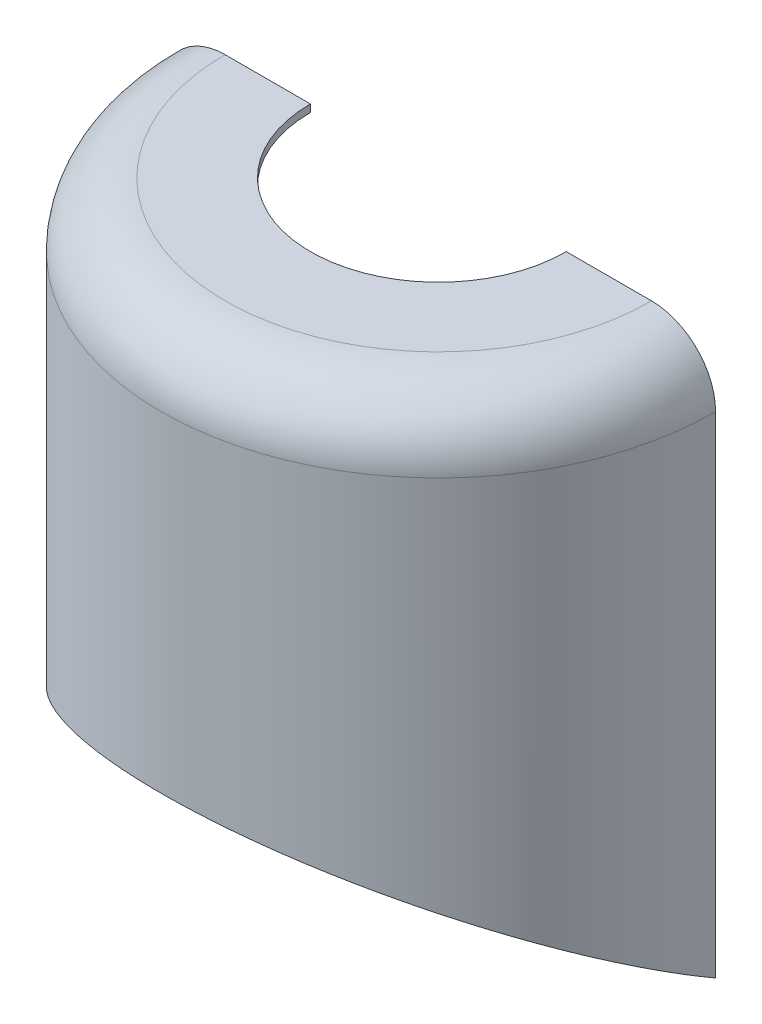
ISO-10303-21;
HEADER;
FILE_DESCRIPTION(('STEP AP214'),'2;1');
FILE_NAME('part.step','',(''),(''),'','','');
FILE_SCHEMA(('AUTOMOTIVE_DESIGN { 1 0 10303 214 1 1 1 1 }'));
ENDSEC;
DATA;
#1=APPLICATION_CONTEXT('core data for automotive mechanical design processes');
#2=APPLICATION_PROTOCOL_DEFINITION('international standard','automotive_design',2000,#1);
#3=PRODUCT_CONTEXT('',#1,'mechanical');
#4=PRODUCT('Part','Part','',(#3));
#5=PRODUCT_RELATED_PRODUCT_CATEGORY('part','',(#4));
#6=PRODUCT_DEFINITION_FORMATION('','',#4);
#7=PRODUCT_DEFINITION_CONTEXT('part definition',#1,'design');
#8=PRODUCT_DEFINITION('design','',#6,#7);
#9=PRODUCT_DEFINITION_SHAPE('','',#8);
#10=(LENGTH_UNIT() NAMED_UNIT(*) SI_UNIT(.MILLI.,.METRE.));
#11=(NAMED_UNIT(*) PLANE_ANGLE_UNIT() SI_UNIT($,.RADIAN.));
#12=(NAMED_UNIT(*) SI_UNIT($,.STERADIAN.) SOLID_ANGLE_UNIT());
#13=UNCERTAINTY_MEASURE_WITH_UNIT(LENGTH_MEASURE(1.E-05),#10,'distance_accuracy_value','');
#14=(GEOMETRIC_REPRESENTATION_CONTEXT(3) GLOBAL_UNCERTAINTY_ASSIGNED_CONTEXT((#13)) GLOBAL_UNIT_ASSIGNED_CONTEXT((#10,
#11,#12)) REPRESENTATION_CONTEXT('',''));
#15=CARTESIAN_POINT('',(0.,0.,0.));
#16=DIRECTION('',(0.,0.,1.));
#17=DIRECTION('',(1.,0.,0.));
#18=AXIS2_PLACEMENT_3D('',#15,#16,#17);
#19=CARTESIAN_POINT('',(26.,52.,-13.));
#20=DIRECTION('',(0.,0.,1.));
#21=DIRECTION('',(1.,0.,0.));
#22=AXIS2_PLACEMENT_3D('',#19,#20,#21);
#23=PLANE('',#22);
#24=DIRECTION('',(-1.,0.,0.));
#25=VECTOR('',#24,1.);
#26=CARTESIAN_POINT('',(26.,51.3,-13.));
#27=LINE('',#26,#25);
#28=CARTESIAN_POINT('',(20.,51.3,-13.));
#29=VERTEX_POINT('',#28);
#30=CARTESIAN_POINT('',(12.,51.3,-13.));
#31=VERTEX_POINT('',#30);
#32=EDGE_CURVE('E122',#29,#31,#27,.T.);
#33=ORIENTED_EDGE('',*,*,#32,.T.);
#34=DIRECTION('',(0.,1.,0.));
#35=VECTOR('',#34,1.);
#36=CARTESIAN_POINT('',(12.,20.,-13.));
#37=LINE('',#36,#35);
#38=CARTESIAN_POINT('',(12.,52.,-13.));
#39=VERTEX_POINT('',#38);
#40=EDGE_CURVE('E59',#31,#39,#37,.T.);
#41=ORIENTED_EDGE('',*,*,#40,.T.);
#42=DIRECTION('',(-1.,0.,0.));
#43=VECTOR('',#42,1.);
#44=CARTESIAN_POINT('',(26.,52.,-13.));
#45=LINE('',#44,#43);
#46=CARTESIAN_POINT('',(20.,52.,-13.));
#47=VERTEX_POINT('',#46);
#48=EDGE_CURVE('E119',#47,#39,#45,.T.);
#49=ORIENTED_EDGE('',*,*,#48,.F.);
#50=CARTESIAN_POINT('',(20.,46.,-13.));
#51=DIRECTION('',(0.,0.,1.));
#52=DIRECTION('',(1.,0.,0.));
#53=AXIS2_PLACEMENT_3D('',#50,#51,#52);
#54=CIRCLE('',#53,6.);
#55=CARTESIAN_POINT('',(26.,46.,-13.));
#56=VERTEX_POINT('',#55);
#57=EDGE_CURVE('E156',#47,#56,#54,.F.);
#58=ORIENTED_EDGE('',*,*,#57,.T.);
#59=DIRECTION('',(0.,-1.,0.));
#60=VECTOR('',#59,1.);
#61=CARTESIAN_POINT('',(26.,52.,-13.));
#62=LINE('',#61,#60);
#63=CARTESIAN_POINT('',(26.,0.,-13.));
#64=VERTEX_POINT('',#63);
#65=EDGE_CURVE('E137',#56,#64,#62,.T.);
#66=ORIENTED_EDGE('',*,*,#65,.T.);
#67=DIRECTION('',(-1.,0.,0.));
#68=VECTOR('',#67,1.);
#69=CARTESIAN_POINT('',(26.,0.,-13.));
#70=LINE('',#69,#68);
#71=CARTESIAN_POINT('',(-26.,0.,-13.));
#72=VERTEX_POINT('',#71);
#73=EDGE_CURVE('E139',#64,#72,#70,.T.);
#74=ORIENTED_EDGE('',*,*,#73,.T.);
#75=DIRECTION('',(0.,-1.,0.));
#76=VECTOR('',#75,1.);
#77=CARTESIAN_POINT('',(-26.,52.,-13.));
#78=LINE('',#77,#76);
#79=CARTESIAN_POINT('',(-26.,46.,-13.));
#80=VERTEX_POINT('',#79);
#81=EDGE_CURVE('E131',#80,#72,#78,.T.);
#82=ORIENTED_EDGE('',*,*,#81,.F.);
#83=CARTESIAN_POINT('',(-20.,46.,-13.));
#84=DIRECTION('',(0.,0.,1.));
#85=DIRECTION('',(1.,0.,0.));
#86=AXIS2_PLACEMENT_3D('',#83,#84,#85);
#87=CIRCLE('',#86,6.);
#88=CARTESIAN_POINT('',(-20.,52.,-13.));
#89=VERTEX_POINT('',#88);
#90=EDGE_CURVE('E152',#80,#89,#87,.F.);
#91=ORIENTED_EDGE('',*,*,#90,.T.);
#92=CARTESIAN_POINT('',(-12.,52.,-13.));
#93=VERTEX_POINT('',#92);
#94=EDGE_CURVE('E132',#93,#89,#45,.T.);
#95=ORIENTED_EDGE('',*,*,#94,.F.);
#96=DIRECTION('',(0.,1.,0.));
#97=VECTOR('',#96,1.);
#98=CARTESIAN_POINT('',(-12.,20.,-13.));
#99=LINE('',#98,#97);
#100=CARTESIAN_POINT('',(-12.,51.3,-13.));
#101=VERTEX_POINT('',#100);
#102=EDGE_CURVE('E110',#93,#101,#99,.F.);
#103=ORIENTED_EDGE('',*,*,#102,.T.);
#104=CARTESIAN_POINT('',(-20.,51.3,-13.));
#105=VERTEX_POINT('',#104);
#106=EDGE_CURVE('E276',#101,#105,#27,.T.);
#107=ORIENTED_EDGE('',*,*,#106,.T.);
#108=CARTESIAN_POINT('',(-20.,46.,-13.));
#109=DIRECTION('',(0.,0.,1.));
#110=DIRECTION('',(1.,0.,0.));
#111=AXIS2_PLACEMENT_3D('',#108,#109,#110);
#112=CIRCLE('',#111,5.3);
#113=CARTESIAN_POINT('',(-25.3,46.,-13.));
#114=VERTEX_POINT('',#113);
#115=EDGE_CURVE('E288',#114,#105,#112,.F.);
#116=ORIENTED_EDGE('',*,*,#115,.F.);
#117=DIRECTION('',(0.,-1.,0.));
#118=VECTOR('',#117,1.);
#119=CARTESIAN_POINT('',(-25.3,46.,-13.));
#120=LINE('',#119,#118);
#121=CARTESIAN_POINT('',(-25.3,0.808140901066355,-13.));
#122=VERTEX_POINT('',#121);
#123=EDGE_CURVE('E66',#114,#122,#120,.T.);
#124=ORIENTED_EDGE('',*,*,#123,.T.);
#125=DIRECTION('',(-1.,0.,0.));
#126=VECTOR('',#125,1.);
#127=CARTESIAN_POINT('',(26.,0.808140901066359,-13.));
#128=LINE('',#127,#126);
#129=CARTESIAN_POINT('',(25.3,0.80814090106635,-13.));
#130=VERTEX_POINT('',#129);
#131=EDGE_CURVE('E281',#130,#122,#128,.T.);
#132=ORIENTED_EDGE('',*,*,#131,.F.);
#133=DIRECTION('',(0.,-1.,0.));
#134=VECTOR('',#133,1.);
#135=CARTESIAN_POINT('',(25.3,46.,-13.));
#136=LINE('',#135,#134);
#137=CARTESIAN_POINT('',(25.3,46.,-13.));
#138=VERTEX_POINT('',#137);
#139=EDGE_CURVE('E294',#138,#130,#136,.T.);
#140=ORIENTED_EDGE('',*,*,#139,.F.);
#141=CARTESIAN_POINT('',(20.,46.,-13.));
#142=DIRECTION('',(0.,0.,1.));
#143=DIRECTION('',(1.,0.,0.));
#144=AXIS2_PLACEMENT_3D('',#141,#142,#143);
#145=CIRCLE('',#144,5.3);
#146=EDGE_CURVE('E290',#29,#138,#145,.F.);
#147=ORIENTED_EDGE('',*,*,#146,.F.);
#148=EDGE_LOOP('',(#33,#41,#49,#58,#66,#74,#82,#91,#95,#103,#107,#116,#124,#132,#140,#147));
#149=FACE_BOUND('',#148,.T.);
#150=ADVANCED_FACE('F43',(#149),#23,.F.);
#151=CARTESIAN_POINT('',(0.,52.,-13.));
#152=DIRECTION('',(0.,-1.,0.));
#153=DIRECTION('',(0.,0.,-1.));
#154=AXIS2_PLACEMENT_3D('',#151,#152,#153);
#155=CYLINDRICAL_SURFACE('',#154,26.);
#156=ORIENTED_EDGE('',*,*,#81,.T.);
#157=CARTESIAN_POINT('',(0.,0.,-13.));
#158=DIRECTION('',(0.,0.8661855860486,-0.499722453489577));
#159=DIRECTION('',(0.,-0.499722453489577,-0.866185586048601));
#160=AXIS2_PLACEMENT_3D('',#157,#158,#159);
#161=ELLIPSE('',#160,30.0166620396073,26.);
#162=EDGE_CURVE('E142',#72,#64,#161,.T.);
#163=ORIENTED_EDGE('',*,*,#162,.T.);
#164=ORIENTED_EDGE('',*,*,#65,.F.);
#165=CARTESIAN_POINT('',(0.,46.,-13.));
#166=DIRECTION('',(0.,1.,0.));
#167=DIRECTION('',(0.,0.,1.));
#168=AXIS2_PLACEMENT_3D('',#165,#166,#167);
#169=CIRCLE('',#168,26.);
#170=EDGE_CURVE('E52',#56,#80,#169,.F.);
#171=ORIENTED_EDGE('',*,*,#170,.T.);
#172=EDGE_LOOP('',(#156,#163,#164,#171));
#173=FACE_BOUND('',#172,.T.);
#174=ADVANCED_FACE('F163',(#173),#155,.T.);
#175=CARTESIAN_POINT('',(0.,52.,-13.));
#176=DIRECTION('',(0.,1.,0.));
#177=DIRECTION('',(0.,0.,1.));
#178=AXIS2_PLACEMENT_3D('',#175,#176,#177);
#179=PLANE('',#178);
#180=CARTESIAN_POINT('',(0.,52.,-13.));
#181=DIRECTION('',(0.,1.,0.));
#182=DIRECTION('',(0.,0.,1.));
#183=AXIS2_PLACEMENT_3D('',#180,#181,#182);
#184=CIRCLE('',#183,12.);
#185=EDGE_CURVE('E107',#93,#39,#184,.T.);
#186=ORIENTED_EDGE('',*,*,#185,.F.);
#187=ORIENTED_EDGE('',*,*,#94,.T.);
#188=CARTESIAN_POINT('',(0.,52.,-13.));
#189=DIRECTION('',(0.,1.,0.));
#190=DIRECTION('',(0.,0.,1.));
#191=AXIS2_PLACEMENT_3D('',#188,#189,#190);
#192=CIRCLE('',#191,20.);
#193=EDGE_CURVE('E129',#89,#47,#192,.T.);
#194=ORIENTED_EDGE('',*,*,#193,.T.);
#195=ORIENTED_EDGE('',*,*,#48,.T.);
#196=EDGE_LOOP('',(#186,#187,#194,#195));
#197=FACE_BOUND('',#196,.T.);
#198=ADVANCED_FACE('F127',(#197),#179,.T.);
#199=CARTESIAN_POINT('',(0.,46.,-13.));
#200=DIRECTION('',(0.,1.,0.));
#201=DIRECTION('',(0.,0.,1.));
#202=AXIS2_PLACEMENT_3D('',#199,#200,#201);
#203=TOROIDAL_SURFACE('',#202,20.,6.);
#204=ORIENTED_EDGE('',*,*,#90,.F.);
#205=ORIENTED_EDGE('',*,*,#170,.F.);
#206=ORIENTED_EDGE('',*,*,#57,.F.);
#207=ORIENTED_EDGE('',*,*,#193,.F.);
#208=EDGE_LOOP('',(#204,#205,#206,#207));
#209=FACE_BOUND('',#208,.T.);
#210=ADVANCED_FACE('F45',(#209),#203,.T.);
#211=CARTESIAN_POINT('',(-26.,0.,-13.));
#212=DIRECTION('',(0.,0.8661855860486,-0.499722453489577));
#213=DIRECTION('',(0.,0.499722453489577,0.8661855860486));
#214=AXIS2_PLACEMENT_3D('',#211,#212,#213);
#215=PLANE('',#214);
#216=ORIENTED_EDGE('',*,*,#73,.F.);
#217=ORIENTED_EDGE('',*,*,#162,.F.);
#218=EDGE_LOOP('',(#216,#217));
#219=FACE_BOUND('',#218,.T.);
#220=ADVANCED_FACE('F168',(#219),#215,.F.);
#221=CARTESIAN_POINT('',(0.,52.,-13.));
#222=DIRECTION('',(0.,-1.,0.));
#223=DIRECTION('',(0.,0.,-1.));
#224=AXIS2_PLACEMENT_3D('',#221,#222,#223);
#225=CYLINDRICAL_SURFACE('',#224,25.3);
#226=ORIENTED_EDGE('',*,*,#123,.F.);
#227=CARTESIAN_POINT('',(0.,46.,-13.));
#228=DIRECTION('',(0.,-1.,0.));
#229=DIRECTION('',(0.,0.,-1.));
#230=AXIS2_PLACEMENT_3D('',#227,#228,#229);
#231=CIRCLE('',#230,25.3);
#232=EDGE_CURVE('E293',#138,#114,#231,.T.);
#233=ORIENTED_EDGE('',*,*,#232,.F.);
#234=ORIENTED_EDGE('',*,*,#139,.T.);
#235=CARTESIAN_POINT('',(0.,0.808140901066359,-13.));
#236=DIRECTION('',(0.,0.8661855860486,-0.499722453489577));
#237=DIRECTION('',(0.,-0.499722453489577,-0.866185586048601));
#238=AXIS2_PLACEMENT_3D('',#235,#236,#237);
#239=ELLIPSE('',#238,29.2085211385409,25.3);
#240=EDGE_CURVE('E124',#122,#130,#239,.T.);
#241=ORIENTED_EDGE('',*,*,#240,.F.);
#242=EDGE_LOOP('',(#226,#233,#234,#241));
#243=FACE_BOUND('',#242,.T.);
#244=ADVANCED_FACE('F173',(#243),#225,.F.);
#245=CARTESIAN_POINT('',(0.,51.3,-13.));
#246=DIRECTION('',(0.,1.,0.));
#247=DIRECTION('',(0.,0.,1.));
#248=AXIS2_PLACEMENT_3D('',#245,#246,#247);
#249=PLANE('',#248);
#250=ORIENTED_EDGE('',*,*,#106,.F.);
#251=CARTESIAN_POINT('',(0.,51.3,-13.));
#252=DIRECTION('',(0.,1.,0.));
#253=DIRECTION('',(0.,0.,1.));
#254=AXIS2_PLACEMENT_3D('',#251,#252,#253);
#255=CIRCLE('',#254,12.);
#256=EDGE_CURVE('E11',#101,#31,#255,.T.);
#257=ORIENTED_EDGE('',*,*,#256,.T.);
#258=ORIENTED_EDGE('',*,*,#32,.F.);
#259=CARTESIAN_POINT('',(0.,51.3,-13.));
#260=DIRECTION('',(0.,1.,0.));
#261=DIRECTION('',(0.,0.,1.));
#262=AXIS2_PLACEMENT_3D('',#259,#260,#261);
#263=CIRCLE('',#262,20.);
#264=EDGE_CURVE('E277',#105,#29,#263,.T.);
#265=ORIENTED_EDGE('',*,*,#264,.F.);
#266=EDGE_LOOP('',(#250,#257,#258,#265));
#267=FACE_BOUND('',#266,.T.);
#268=ADVANCED_FACE('F190',(#267),#249,.F.);
#269=CARTESIAN_POINT('',(0.,46.,-13.));
#270=DIRECTION('',(0.,1.,0.));
#271=DIRECTION('',(0.,0.,1.));
#272=AXIS2_PLACEMENT_3D('',#269,#270,#271);
#273=TOROIDAL_SURFACE('',#272,20.,5.3);
#274=ORIENTED_EDGE('',*,*,#115,.T.);
#275=ORIENTED_EDGE('',*,*,#264,.T.);
#276=ORIENTED_EDGE('',*,*,#146,.T.);
#277=ORIENTED_EDGE('',*,*,#232,.T.);
#278=EDGE_LOOP('',(#274,#275,#276,#277));
#279=FACE_BOUND('',#278,.T.);
#280=ADVANCED_FACE('F186',(#279),#273,.F.);
#281=CARTESIAN_POINT('',(-26.,0.60632991023402,-13.3498057174427));
#282=DIRECTION('',(0.,0.8661855860486,-0.499722453489577));
#283=DIRECTION('',(0.,0.499722453489577,0.8661855860486));
#284=AXIS2_PLACEMENT_3D('',#281,#282,#283);
#285=PLANE('',#284);
#286=ORIENTED_EDGE('',*,*,#131,.T.);
#287=ORIENTED_EDGE('',*,*,#240,.T.);
#288=EDGE_LOOP('',(#286,#287));
#289=FACE_BOUND('',#288,.T.);
#290=ADVANCED_FACE('F183',(#289),#285,.T.);
#291=CARTESIAN_POINT('',(0.,20.,-13.));
#292=DIRECTION('',(0.,1.,0.));
#293=DIRECTION('',(0.,0.,1.));
#294=AXIS2_PLACEMENT_3D('',#291,#292,#293);
#295=CYLINDRICAL_SURFACE('',#294,12.);
#296=ORIENTED_EDGE('',*,*,#256,.F.);
#297=ORIENTED_EDGE('',*,*,#102,.F.);
#298=ORIENTED_EDGE('',*,*,#185,.T.);
#299=ORIENTED_EDGE('',*,*,#40,.F.);
#300=EDGE_LOOP('',(#296,#297,#298,#299));
#301=FACE_BOUND('',#300,.T.);
#302=ADVANCED_FACE('F108',(#301),#295,.F.);
#303=CLOSED_SHELL('',(#150,#174,#198,#210,#220,#244,#268,#280,#290,#302));
#304=MANIFOLD_SOLID_BREP('B2',#303);
#305=ADVANCED_BREP_SHAPE_REPRESENTATION('',(#18,#304),#14);
#306=SHAPE_DEFINITION_REPRESENTATION(#9,#305);
ENDSEC;
END-ISO-10303-21;
